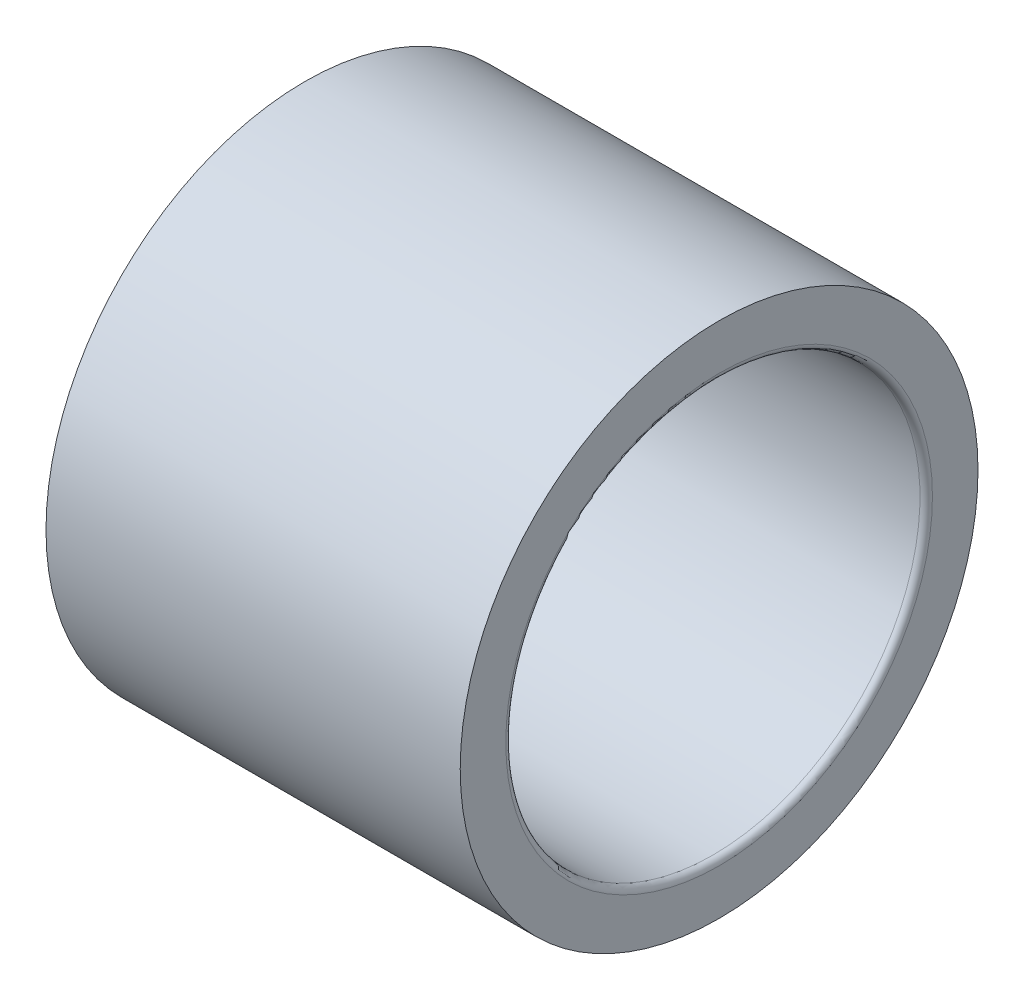
ISO-10303-21;
HEADER;
FILE_DESCRIPTION(('STEP AP214'),'2;1');
FILE_NAME('part.step','',(''),(''),'','','');
FILE_SCHEMA(('AUTOMOTIVE_DESIGN { 1 0 10303 214 1 1 1 1 }'));
ENDSEC;
DATA;
#1=APPLICATION_CONTEXT('core data for automotive mechanical design processes');
#2=APPLICATION_PROTOCOL_DEFINITION('international standard','automotive_design',2000,#1);
#3=PRODUCT_CONTEXT('',#1,'mechanical');
#4=PRODUCT('Part','Part','',(#3));
#5=PRODUCT_RELATED_PRODUCT_CATEGORY('part','',(#4));
#6=PRODUCT_DEFINITION_FORMATION('','',#4);
#7=PRODUCT_DEFINITION_CONTEXT('part definition',#1,'design');
#8=PRODUCT_DEFINITION('design','',#6,#7);
#9=PRODUCT_DEFINITION_SHAPE('','',#8);
#10=(LENGTH_UNIT() NAMED_UNIT(*) SI_UNIT(.MILLI.,.METRE.));
#11=(NAMED_UNIT(*) PLANE_ANGLE_UNIT() SI_UNIT($,.RADIAN.));
#12=(NAMED_UNIT(*) SI_UNIT($,.STERADIAN.) SOLID_ANGLE_UNIT());
#13=UNCERTAINTY_MEASURE_WITH_UNIT(LENGTH_MEASURE(1.E-05),#10,'distance_accuracy_value','');
#14=(GEOMETRIC_REPRESENTATION_CONTEXT(3) GLOBAL_UNCERTAINTY_ASSIGNED_CONTEXT((#13)) GLOBAL_UNIT_ASSIGNED_CONTEXT((#10,
#11,#12)) REPRESENTATION_CONTEXT('',''));
#15=CARTESIAN_POINT('',(0.,0.,0.));
#16=DIRECTION('',(0.,0.,1.));
#17=DIRECTION('',(1.,0.,0.));
#18=AXIS2_PLACEMENT_3D('',#15,#16,#17);
#19=CARTESIAN_POINT('',(0.299999999999999,0.,0.));
#20=DIRECTION('',(-1.,0.,0.));
#21=DIRECTION('',(0.,-1.,0.));
#22=AXIS2_PLACEMENT_3D('',#19,#20,#21);
#23=TOROIDAL_SURFACE('',#22,10.3,0.300000000000001);
#24=CARTESIAN_POINT('',(0.3,0.,0.));
#25=DIRECTION('',(-1.,0.,0.));
#26=DIRECTION('',(0.,-1.,0.));
#27=AXIS2_PLACEMENT_3D('',#24,#25,#26);
#28=CIRCLE('',#27,10.);
#29=CARTESIAN_POINT('',(0.299999999999998,-10.,0.));
#30=VERTEX_POINT('',#29);
#31=EDGE_CURVE('E10',#30,#30,#28,.T.);
#32=ORIENTED_EDGE('',*,*,#31,.F.);
#33=EDGE_LOOP('',(#32));
#34=FACE_BOUND('',#33,.T.);
#35=CARTESIAN_POINT('',(0.,0.,0.));
#36=DIRECTION('',(-1.,0.,0.));
#37=DIRECTION('',(0.,-1.,0.));
#38=AXIS2_PLACEMENT_3D('',#35,#36,#37);
#39=CIRCLE('',#38,10.3);
#40=CARTESIAN_POINT('',(0.,-10.3,0.));
#41=VERTEX_POINT('',#40);
#42=EDGE_CURVE('E56',#41,#41,#39,.T.);
#43=ORIENTED_EDGE('',*,*,#42,.T.);
#44=EDGE_LOOP('',(#43));
#45=FACE_BOUND('',#44,.T.);
#46=ADVANCED_FACE('F34',(#34,#45),#23,.T.);
#47=CARTESIAN_POINT('',(0.,0.,0.));
#48=DIRECTION('',(-1.,0.,0.));
#49=DIRECTION('',(0.,-1.,0.));
#50=AXIS2_PLACEMENT_3D('',#47,#48,#49);
#51=CYLINDRICAL_SURFACE('',#50,10.);
#52=CARTESIAN_POINT('',(19.7,0.,0.));
#53=DIRECTION('',(-1.,0.,0.));
#54=DIRECTION('',(0.,-1.,0.));
#55=AXIS2_PLACEMENT_3D('',#52,#53,#54);
#56=CIRCLE('',#55,10.);
#57=CARTESIAN_POINT('',(19.7,-10.,0.));
#58=VERTEX_POINT('',#57);
#59=EDGE_CURVE('E40',#58,#58,#56,.T.);
#60=ORIENTED_EDGE('',*,*,#59,.F.);
#61=EDGE_LOOP('',(#60));
#62=FACE_BOUND('',#61,.T.);
#63=ORIENTED_EDGE('',*,*,#31,.T.);
#64=EDGE_LOOP('',(#63));
#65=FACE_BOUND('',#64,.T.);
#66=ADVANCED_FACE('F81',(#62,#65),#51,.F.);
#67=CARTESIAN_POINT('',(19.7,0.,0.));
#68=DIRECTION('',(-1.,0.,0.));
#69=DIRECTION('',(0.,-1.,0.));
#70=AXIS2_PLACEMENT_3D('',#67,#68,#69);
#71=TOROIDAL_SURFACE('',#70,10.3,0.299999999999998);
#72=CARTESIAN_POINT('',(20.,0.,0.));
#73=DIRECTION('',(-1.,0.,0.));
#74=DIRECTION('',(0.,-1.,0.));
#75=AXIS2_PLACEMENT_3D('',#72,#73,#74);
#76=CIRCLE('',#75,10.3);
#77=CARTESIAN_POINT('',(20.,-10.3,0.));
#78=VERTEX_POINT('',#77);
#79=EDGE_CURVE('E44',#78,#78,#76,.T.);
#80=ORIENTED_EDGE('',*,*,#79,.F.);
#81=EDGE_LOOP('',(#80));
#82=FACE_BOUND('',#81,.T.);
#83=ORIENTED_EDGE('',*,*,#59,.T.);
#84=EDGE_LOOP('',(#83));
#85=FACE_BOUND('',#84,.T.);
#86=ADVANCED_FACE('F76',(#82,#85),#71,.T.);
#87=CARTESIAN_POINT('',(20.,10.3,0.));
#88=DIRECTION('',(-1.,0.,0.));
#89=DIRECTION('',(0.,-1.,0.));
#90=AXIS2_PLACEMENT_3D('',#87,#88,#89);
#91=PLANE('',#90);
#92=CARTESIAN_POINT('',(20.,0.,0.));
#93=DIRECTION('',(-1.,0.,0.));
#94=DIRECTION('',(0.,-1.,0.));
#95=AXIS2_PLACEMENT_3D('',#92,#93,#94);
#96=CIRCLE('',#95,12.5);
#97=CARTESIAN_POINT('',(20.,-12.5,0.));
#98=VERTEX_POINT('',#97);
#99=EDGE_CURVE('E48',#98,#98,#96,.T.);
#100=ORIENTED_EDGE('',*,*,#99,.F.);
#101=EDGE_LOOP('',(#100));
#102=FACE_BOUND('',#101,.T.);
#103=ORIENTED_EDGE('',*,*,#79,.T.);
#104=EDGE_LOOP('',(#103));
#105=FACE_BOUND('',#104,.T.);
#106=ADVANCED_FACE('F70',(#102,#105),#91,.F.);
#107=CARTESIAN_POINT('',(0.,0.,0.));
#108=DIRECTION('',(-1.,0.,0.));
#109=DIRECTION('',(0.,-1.,0.));
#110=AXIS2_PLACEMENT_3D('',#107,#108,#109);
#111=CYLINDRICAL_SURFACE('',#110,12.5);
#112=CARTESIAN_POINT('',(0.,0.,0.));
#113=DIRECTION('',(-1.,0.,0.));
#114=DIRECTION('',(0.,-1.,0.));
#115=AXIS2_PLACEMENT_3D('',#112,#113,#114);
#116=CIRCLE('',#115,12.5);
#117=CARTESIAN_POINT('',(0.,-12.5,0.));
#118=VERTEX_POINT('',#117);
#119=EDGE_CURVE('E53',#118,#118,#116,.T.);
#120=ORIENTED_EDGE('',*,*,#119,.F.);
#121=EDGE_LOOP('',(#120));
#122=FACE_BOUND('',#121,.T.);
#123=ORIENTED_EDGE('',*,*,#99,.T.);
#124=EDGE_LOOP('',(#123));
#125=FACE_BOUND('',#124,.T.);
#126=ADVANCED_FACE('F64',(#122,#125),#111,.T.);
#127=CARTESIAN_POINT('',(0.,12.5,0.));
#128=DIRECTION('',(1.,0.,0.));
#129=DIRECTION('',(0.,1.,0.));
#130=AXIS2_PLACEMENT_3D('',#127,#128,#129);
#131=PLANE('',#130);
#132=ORIENTED_EDGE('',*,*,#42,.F.);
#133=EDGE_LOOP('',(#132));
#134=FACE_BOUND('',#133,.T.);
#135=ORIENTED_EDGE('',*,*,#119,.T.);
#136=EDGE_LOOP('',(#135));
#137=FACE_BOUND('',#136,.T.);
#138=ADVANCED_FACE('F61',(#134,#137),#131,.F.);
#139=CLOSED_SHELL('',(#46,#66,#86,#106,#126,#138));
#140=MANIFOLD_SOLID_BREP('B2',#139);
#141=ADVANCED_BREP_SHAPE_REPRESENTATION('',(#18,#140),#14);
#142=SHAPE_DEFINITION_REPRESENTATION(#9,#141);
ENDSEC;
END-ISO-10303-21;
